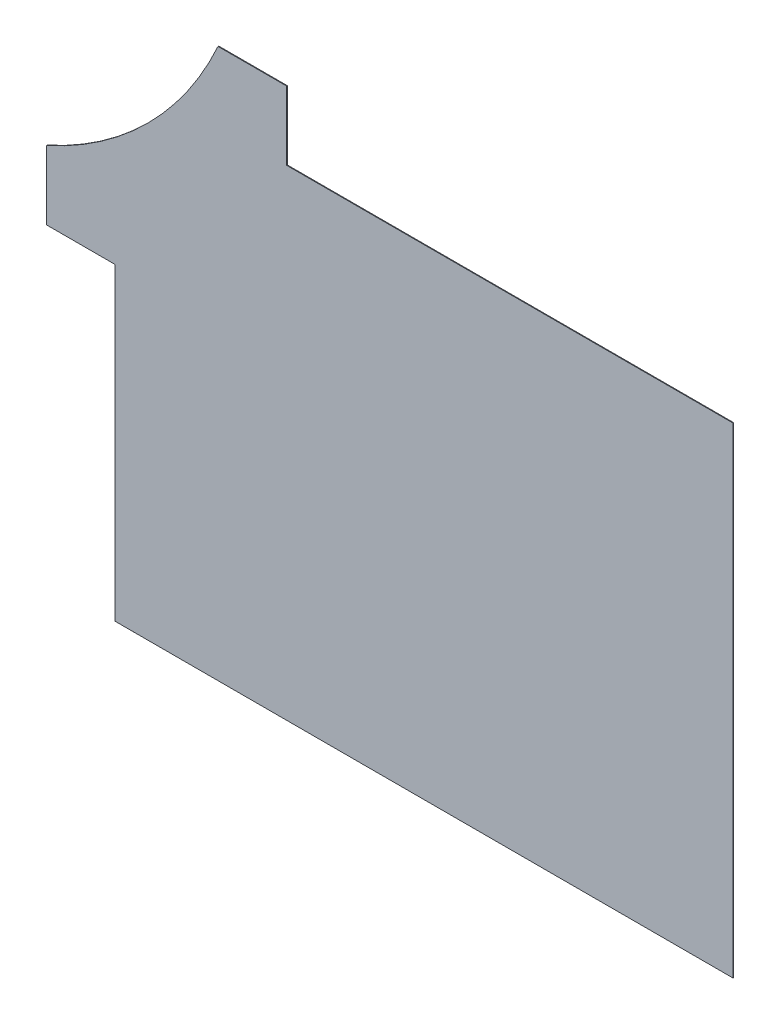
ISO-10303-21;
HEADER;
FILE_DESCRIPTION(('STEP AP214'),'2;1');
FILE_NAME('part.step','',(''),(''),'','','');
FILE_SCHEMA(('AUTOMOTIVE_DESIGN { 1 0 10303 214 1 1 1 1 }'));
ENDSEC;
DATA;
#1=APPLICATION_CONTEXT('core data for automotive mechanical design processes');
#2=APPLICATION_PROTOCOL_DEFINITION('international standard','automotive_design',2000,#1);
#3=PRODUCT_CONTEXT('',#1,'mechanical');
#4=PRODUCT('Part','Part','',(#3));
#5=PRODUCT_RELATED_PRODUCT_CATEGORY('part','',(#4));
#6=PRODUCT_DEFINITION_FORMATION('','',#4);
#7=PRODUCT_DEFINITION_CONTEXT('part definition',#1,'design');
#8=PRODUCT_DEFINITION('design','',#6,#7);
#9=PRODUCT_DEFINITION_SHAPE('','',#8);
#10=(LENGTH_UNIT() NAMED_UNIT(*) SI_UNIT(.MILLI.,.METRE.));
#11=(NAMED_UNIT(*) PLANE_ANGLE_UNIT() SI_UNIT($,.RADIAN.));
#12=(NAMED_UNIT(*) SI_UNIT($,.STERADIAN.) SOLID_ANGLE_UNIT());
#13=UNCERTAINTY_MEASURE_WITH_UNIT(LENGTH_MEASURE(1.E-05),#10,'distance_accuracy_value','');
#14=(GEOMETRIC_REPRESENTATION_CONTEXT(3) GLOBAL_UNCERTAINTY_ASSIGNED_CONTEXT((#13)) GLOBAL_UNIT_ASSIGNED_CONTEXT((#10,
#11,#12)) REPRESENTATION_CONTEXT('',''));
#15=CARTESIAN_POINT('',(0.,0.,0.));
#16=DIRECTION('',(0.,0.,1.));
#17=DIRECTION('',(1.,0.,0.));
#18=AXIS2_PLACEMENT_3D('',#15,#16,#17);
#19=CARTESIAN_POINT('',(-1.805718913883,1.455718913883,0.));
#20=DIRECTION('',(0.,0.,1.));
#21=DIRECTION('',(-0.411437827766147,0.911437827766148,0.));
#22=AXIS2_PLACEMENT_3D('',#19,#20,#21);
#23=CYLINDRICAL_SURFACE('',#22,0.5);
#24=CARTESIAN_POINT('',(-1.805718913883,1.455718913883,0.));
#25=DIRECTION('',(0.,0.,-1.));
#26=DIRECTION('',(-0.411437827766147,0.911437827766148,0.));
#27=AXIS2_PLACEMENT_3D('',#24,#25,#26);
#28=CIRCLE('',#27,0.5);
#29=CARTESIAN_POINT('',(-1.35,1.25,0.));
#30=VERTEX_POINT('',#29);
#31=CARTESIAN_POINT('',(-1.6,1.,0.));
#32=VERTEX_POINT('',#31);
#33=EDGE_CURVE('E11',#30,#32,#28,.T.);
#34=ORIENTED_EDGE('',*,*,#33,.T.);
#35=DIRECTION('',(0.,0.,1.));
#36=VECTOR('',#35,1.);
#37=CARTESIAN_POINT('',(-1.6,1.,0.));
#38=LINE('',#37,#36);
#39=CARTESIAN_POINT('',(-1.6,1.,0.001));
#40=VERTEX_POINT('',#39);
#41=EDGE_CURVE('E24',#32,#40,#38,.T.);
#42=ORIENTED_EDGE('',*,*,#41,.T.);
#43=CARTESIAN_POINT('',(-1.805718913883,1.455718913883,0.001));
#44=DIRECTION('',(0.,0.,-1.));
#45=DIRECTION('',(-0.411437827766147,0.911437827766148,0.));
#46=AXIS2_PLACEMENT_3D('',#43,#44,#45);
#47=CIRCLE('',#46,0.5);
#48=CARTESIAN_POINT('',(-1.35,1.25,0.001));
#49=VERTEX_POINT('',#48);
#50=EDGE_CURVE('E107',#49,#40,#47,.T.);
#51=ORIENTED_EDGE('',*,*,#50,.F.);
#52=DIRECTION('',(0.,0.,1.));
#53=VECTOR('',#52,1.);
#54=CARTESIAN_POINT('',(-1.35,1.25,0.));
#55=LINE('',#54,#53);
#56=EDGE_CURVE('E36',#30,#49,#55,.T.);
#57=ORIENTED_EDGE('',*,*,#56,.F.);
#58=EDGE_LOOP('',(#34,#42,#51,#57));
#59=FACE_BOUND('',#58,.T.);
#60=ADVANCED_FACE('F17',(#59),#23,.F.);
#61=CARTESIAN_POINT('',(-1.25,1.25,0.));
#62=DIRECTION('',(0.,1.,0.));
#63=DIRECTION('',(-1.,0.,0.));
#64=AXIS2_PLACEMENT_3D('',#61,#62,#63);
#65=PLANE('',#64);
#66=DIRECTION('',(-1.,0.,0.));
#67=VECTOR('',#66,1.);
#68=CARTESIAN_POINT('',(1.35,1.25,0.));
#69=LINE('',#68,#67);
#70=CARTESIAN_POINT('',(-1.25,1.25,0.));
#71=VERTEX_POINT('',#70);
#72=EDGE_CURVE('E159',#71,#30,#69,.T.);
#73=ORIENTED_EDGE('',*,*,#72,.T.);
#74=ORIENTED_EDGE('',*,*,#56,.T.);
#75=DIRECTION('',(-1.,0.,0.));
#76=VECTOR('',#75,1.);
#77=CARTESIAN_POINT('',(1.35,1.25,0.001));
#78=LINE('',#77,#76);
#79=CARTESIAN_POINT('',(-1.25,1.25,0.001));
#80=VERTEX_POINT('',#79);
#81=EDGE_CURVE('E157',#80,#49,#78,.T.);
#82=ORIENTED_EDGE('',*,*,#81,.F.);
#83=DIRECTION('',(0.,0.,1.));
#84=VECTOR('',#83,1.);
#85=CARTESIAN_POINT('',(-1.25,1.25,0.));
#86=LINE('',#85,#84);
#87=EDGE_CURVE('E154',#71,#80,#86,.T.);
#88=ORIENTED_EDGE('',*,*,#87,.F.);
#89=EDGE_LOOP('',(#73,#74,#82,#88));
#90=FACE_BOUND('',#89,.T.);
#91=ADVANCED_FACE('F181',(#90),#65,.T.);
#92=CARTESIAN_POINT('',(-1.25,1.15,0.));
#93=DIRECTION('',(1.,0.,0.));
#94=DIRECTION('',(0.,1.,0.));
#95=AXIS2_PLACEMENT_3D('',#92,#93,#94);
#96=PLANE('',#95);
#97=DIRECTION('',(0.,1.,0.));
#98=VECTOR('',#97,1.);
#99=CARTESIAN_POINT('',(-1.25,1.15,0.));
#100=LINE('',#99,#98);
#101=CARTESIAN_POINT('',(-1.25,1.15,0.));
#102=VERTEX_POINT('',#101);
#103=EDGE_CURVE('E151',#102,#71,#100,.T.);
#104=ORIENTED_EDGE('',*,*,#103,.T.);
#105=ORIENTED_EDGE('',*,*,#87,.T.);
#106=DIRECTION('',(0.,1.,0.));
#107=VECTOR('',#106,1.);
#108=CARTESIAN_POINT('',(-1.25,1.15,0.001));
#109=LINE('',#108,#107);
#110=CARTESIAN_POINT('',(-1.25,1.15,0.001));
#111=VERTEX_POINT('',#110);
#112=EDGE_CURVE('E148',#111,#80,#109,.T.);
#113=ORIENTED_EDGE('',*,*,#112,.F.);
#114=DIRECTION('',(0.,0.,1.));
#115=VECTOR('',#114,1.);
#116=CARTESIAN_POINT('',(-1.25,1.15,0.));
#117=LINE('',#116,#115);
#118=EDGE_CURVE('E145',#102,#111,#117,.T.);
#119=ORIENTED_EDGE('',*,*,#118,.F.);
#120=EDGE_LOOP('',(#104,#105,#113,#119));
#121=FACE_BOUND('',#120,.T.);
#122=ADVANCED_FACE('F178',(#121),#96,.T.);
#123=CARTESIAN_POINT('',(-0.6,1.15,0.));
#124=DIRECTION('',(0.,1.,0.));
#125=DIRECTION('',(-1.,0.,0.));
#126=AXIS2_PLACEMENT_3D('',#123,#124,#125);
#127=PLANE('',#126);
#128=DIRECTION('',(-1.,0.,0.));
#129=VECTOR('',#128,1.);
#130=CARTESIAN_POINT('',(-0.6,1.15,0.));
#131=LINE('',#130,#129);
#132=CARTESIAN_POINT('',(-0.6,1.15,0.));
#133=VERTEX_POINT('',#132);
#134=EDGE_CURVE('E142',#133,#102,#131,.T.);
#135=ORIENTED_EDGE('',*,*,#134,.T.);
#136=ORIENTED_EDGE('',*,*,#118,.T.);
#137=DIRECTION('',(-1.,0.,0.));
#138=VECTOR('',#137,1.);
#139=CARTESIAN_POINT('',(-0.6,1.15,0.001));
#140=LINE('',#139,#138);
#141=CARTESIAN_POINT('',(-0.600000000000001,1.15,0.001));
#142=VERTEX_POINT('',#141);
#143=EDGE_CURVE('E139',#142,#111,#140,.T.);
#144=ORIENTED_EDGE('',*,*,#143,.F.);
#145=DIRECTION('',(0.,0.,1.));
#146=VECTOR('',#145,1.);
#147=CARTESIAN_POINT('',(-0.6,1.15,0.));
#148=LINE('',#147,#146);
#149=EDGE_CURVE('E136',#133,#142,#148,.T.);
#150=ORIENTED_EDGE('',*,*,#149,.F.);
#151=EDGE_LOOP('',(#135,#136,#144,#150));
#152=FACE_BOUND('',#151,.T.);
#153=ADVANCED_FACE('F175',(#152),#127,.T.);
#154=CARTESIAN_POINT('',(-0.6,0.45,0.));
#155=DIRECTION('',(1.,0.,0.));
#156=DIRECTION('',(0.,1.,0.));
#157=AXIS2_PLACEMENT_3D('',#154,#155,#156);
#158=PLANE('',#157);
#159=DIRECTION('',(0.,1.,0.));
#160=VECTOR('',#159,1.);
#161=CARTESIAN_POINT('',(-0.6,0.45,0.));
#162=LINE('',#161,#160);
#163=CARTESIAN_POINT('',(-0.6,0.45,0.));
#164=VERTEX_POINT('',#163);
#165=EDGE_CURVE('E133',#164,#133,#162,.T.);
#166=ORIENTED_EDGE('',*,*,#165,.T.);
#167=ORIENTED_EDGE('',*,*,#149,.T.);
#168=DIRECTION('',(0.,1.,0.));
#169=VECTOR('',#168,1.);
#170=CARTESIAN_POINT('',(-0.6,0.45,0.001));
#171=LINE('',#170,#169);
#172=CARTESIAN_POINT('',(-0.6,0.45,0.001));
#173=VERTEX_POINT('',#172);
#174=EDGE_CURVE('E130',#173,#142,#171,.T.);
#175=ORIENTED_EDGE('',*,*,#174,.F.);
#176=DIRECTION('',(0.,0.,1.));
#177=VECTOR('',#176,1.);
#178=CARTESIAN_POINT('',(-0.6,0.45,0.));
#179=LINE('',#178,#177);
#180=EDGE_CURVE('E127',#164,#173,#179,.T.);
#181=ORIENTED_EDGE('',*,*,#180,.F.);
#182=EDGE_LOOP('',(#166,#167,#175,#181));
#183=FACE_BOUND('',#182,.T.);
#184=ADVANCED_FACE('F172',(#183),#158,.T.);
#185=CARTESIAN_POINT('',(-1.5,0.45,0.));
#186=DIRECTION('',(0.,-1.,0.));
#187=DIRECTION('',(1.,0.,0.));
#188=AXIS2_PLACEMENT_3D('',#185,#186,#187);
#189=PLANE('',#188);
#190=DIRECTION('',(1.,0.,0.));
#191=VECTOR('',#190,1.);
#192=CARTESIAN_POINT('',(-1.5,0.45,0.));
#193=LINE('',#192,#191);
#194=CARTESIAN_POINT('',(-1.5,0.45,0.));
#195=VERTEX_POINT('',#194);
#196=EDGE_CURVE('E124',#195,#164,#193,.T.);
#197=ORIENTED_EDGE('',*,*,#196,.T.);
#198=ORIENTED_EDGE('',*,*,#180,.T.);
#199=DIRECTION('',(1.,0.,0.));
#200=VECTOR('',#199,1.);
#201=CARTESIAN_POINT('',(-1.5,0.45,0.001));
#202=LINE('',#201,#200);
#203=CARTESIAN_POINT('',(-1.5,0.45,0.001));
#204=VERTEX_POINT('',#203);
#205=EDGE_CURVE('E121',#204,#173,#202,.T.);
#206=ORIENTED_EDGE('',*,*,#205,.F.);
#207=DIRECTION('',(0.,0.,1.));
#208=VECTOR('',#207,1.);
#209=CARTESIAN_POINT('',(-1.5,0.45,0.));
#210=LINE('',#209,#208);
#211=EDGE_CURVE('E118',#195,#204,#210,.T.);
#212=ORIENTED_EDGE('',*,*,#211,.F.);
#213=EDGE_LOOP('',(#197,#198,#206,#212));
#214=FACE_BOUND('',#213,.T.);
#215=ADVANCED_FACE('F169',(#214),#189,.T.);
#216=CARTESIAN_POINT('',(-1.5,0.9,0.));
#217=DIRECTION('',(-1.,0.,0.));
#218=DIRECTION('',(0.,-1.,0.));
#219=AXIS2_PLACEMENT_3D('',#216,#217,#218);
#220=PLANE('',#219);
#221=DIRECTION('',(0.,-1.,0.));
#222=VECTOR('',#221,1.);
#223=CARTESIAN_POINT('',(-1.5,0.9,0.));
#224=LINE('',#223,#222);
#225=CARTESIAN_POINT('',(-1.5,0.9,0.));
#226=VERTEX_POINT('',#225);
#227=EDGE_CURVE('E115',#226,#195,#224,.T.);
#228=ORIENTED_EDGE('',*,*,#227,.T.);
#229=ORIENTED_EDGE('',*,*,#211,.T.);
#230=DIRECTION('',(0.,-1.,0.));
#231=VECTOR('',#230,1.);
#232=CARTESIAN_POINT('',(-1.5,0.9,0.001));
#233=LINE('',#232,#231);
#234=CARTESIAN_POINT('',(-1.5,0.9,0.001));
#235=VERTEX_POINT('',#234);
#236=EDGE_CURVE('E113',#235,#204,#233,.T.);
#237=ORIENTED_EDGE('',*,*,#236,.F.);
#238=DIRECTION('',(0.,0.,1.));
#239=VECTOR('',#238,1.);
#240=CARTESIAN_POINT('',(-1.5,0.9,0.));
#241=LINE('',#240,#239);
#242=EDGE_CURVE('E94',#226,#235,#241,.T.);
#243=ORIENTED_EDGE('',*,*,#242,.F.);
#244=EDGE_LOOP('',(#228,#229,#237,#243));
#245=FACE_BOUND('',#244,.T.);
#246=ADVANCED_FACE('F167',(#245),#220,.T.);
#247=CARTESIAN_POINT('',(-1.6,0.9,0.));
#248=DIRECTION('',(0.,-1.,0.));
#249=DIRECTION('',(1.,0.,0.));
#250=AXIS2_PLACEMENT_3D('',#247,#248,#249);
#251=PLANE('',#250);
#252=DIRECTION('',(1.,0.,0.));
#253=VECTOR('',#252,1.);
#254=CARTESIAN_POINT('',(-1.6,0.9,0.));
#255=LINE('',#254,#253);
#256=CARTESIAN_POINT('',(-1.6,0.9,0.));
#257=VERTEX_POINT('',#256);
#258=EDGE_CURVE('E98',#257,#226,#255,.T.);
#259=ORIENTED_EDGE('',*,*,#258,.T.);
#260=ORIENTED_EDGE('',*,*,#242,.T.);
#261=DIRECTION('',(1.,0.,0.));
#262=VECTOR('',#261,1.);
#263=CARTESIAN_POINT('',(-1.6,0.9,0.001));
#264=LINE('',#263,#262);
#265=CARTESIAN_POINT('',(-1.6,0.9,0.001));
#266=VERTEX_POINT('',#265);
#267=EDGE_CURVE('E88',#266,#235,#264,.T.);
#268=ORIENTED_EDGE('',*,*,#267,.F.);
#269=DIRECTION('',(0.,0.,1.));
#270=VECTOR('',#269,1.);
#271=CARTESIAN_POINT('',(-1.6,0.9,0.));
#272=LINE('',#271,#270);
#273=EDGE_CURVE('E92',#257,#266,#272,.T.);
#274=ORIENTED_EDGE('',*,*,#273,.F.);
#275=EDGE_LOOP('',(#259,#260,#268,#274));
#276=FACE_BOUND('',#275,.T.);
#277=ADVANCED_FACE('F91',(#276),#251,.T.);
#278=CARTESIAN_POINT('',(-1.6,1.,0.));
#279=DIRECTION('',(-1.,0.,0.));
#280=DIRECTION('',(0.,-1.,0.));
#281=AXIS2_PLACEMENT_3D('',#278,#279,#280);
#282=PLANE('',#281);
#283=DIRECTION('',(0.,-1.,0.));
#284=VECTOR('',#283,1.);
#285=CARTESIAN_POINT('',(-1.6,1.,0.));
#286=LINE('',#285,#284);
#287=EDGE_CURVE('E103',#32,#257,#286,.T.);
#288=ORIENTED_EDGE('',*,*,#287,.T.);
#289=ORIENTED_EDGE('',*,*,#273,.T.);
#290=DIRECTION('',(0.,-1.,0.));
#291=VECTOR('',#290,1.);
#292=CARTESIAN_POINT('',(-1.6,1.,0.001));
#293=LINE('',#292,#291);
#294=EDGE_CURVE('E101',#40,#266,#293,.T.);
#295=ORIENTED_EDGE('',*,*,#294,.F.);
#296=ORIENTED_EDGE('',*,*,#41,.F.);
#297=EDGE_LOOP('',(#288,#289,#295,#296));
#298=FACE_BOUND('',#297,.T.);
#299=ADVANCED_FACE('F100',(#298),#282,.T.);
#300=CARTESIAN_POINT('',(-1.1,0.85,0.001));
#301=DIRECTION('',(0.,0.,1.));
#302=DIRECTION('',(1.,0.,0.));
#303=AXIS2_PLACEMENT_3D('',#300,#301,#302);
#304=PLANE('',#303);
#305=ORIENTED_EDGE('',*,*,#294,.T.);
#306=ORIENTED_EDGE('',*,*,#267,.T.);
#307=ORIENTED_EDGE('',*,*,#236,.T.);
#308=ORIENTED_EDGE('',*,*,#205,.T.);
#309=ORIENTED_EDGE('',*,*,#174,.T.);
#310=ORIENTED_EDGE('',*,*,#143,.T.);
#311=ORIENTED_EDGE('',*,*,#112,.T.);
#312=ORIENTED_EDGE('',*,*,#81,.T.);
#313=ORIENTED_EDGE('',*,*,#50,.T.);
#314=EDGE_LOOP('',(#305,#306,#307,#308,#309,#310,#311,#312,#313));
#315=FACE_BOUND('',#314,.T.);
#316=ADVANCED_FACE('F105',(#315),#304,.T.);
#317=CARTESIAN_POINT('',(-1.1,0.85,0.));
#318=DIRECTION('',(0.,0.,1.));
#319=DIRECTION('',(1.,0.,0.));
#320=AXIS2_PLACEMENT_3D('',#317,#318,#319);
#321=PLANE('',#320);
#322=ORIENTED_EDGE('',*,*,#287,.F.);
#323=ORIENTED_EDGE('',*,*,#33,.F.);
#324=ORIENTED_EDGE('',*,*,#72,.F.);
#325=ORIENTED_EDGE('',*,*,#103,.F.);
#326=ORIENTED_EDGE('',*,*,#134,.F.);
#327=ORIENTED_EDGE('',*,*,#165,.F.);
#328=ORIENTED_EDGE('',*,*,#196,.F.);
#329=ORIENTED_EDGE('',*,*,#227,.F.);
#330=ORIENTED_EDGE('',*,*,#258,.F.);
#331=EDGE_LOOP('',(#322,#323,#324,#325,#326,#327,#328,#329,#330));
#332=FACE_BOUND('',#331,.T.);
#333=ADVANCED_FACE('F164',(#332),#321,.F.);
#334=CLOSED_SHELL('',(#60,#91,#122,#153,#184,#215,#246,#277,#299,#316,#333));
#335=MANIFOLD_SOLID_BREP('B1',#334);
#336=ADVANCED_BREP_SHAPE_REPRESENTATION('',(#18,#335),#14);
#337=SHAPE_DEFINITION_REPRESENTATION(#9,#336);
ENDSEC;
END-ISO-10303-21;
